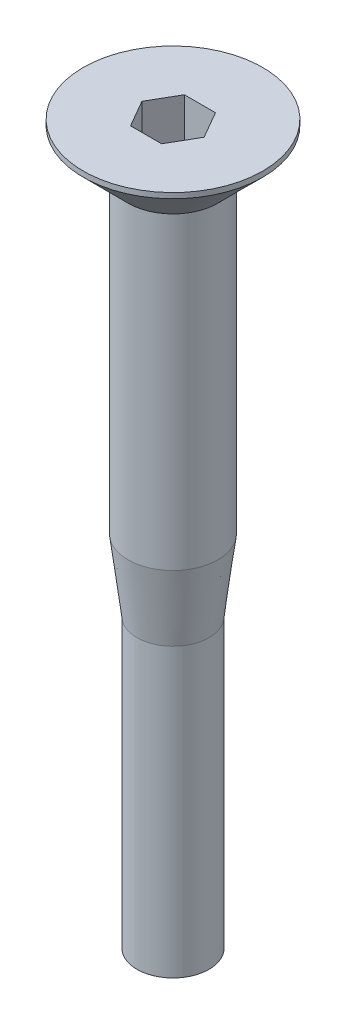
ISO-10303-21;
HEADER;
FILE_DESCRIPTION(('STEP AP214'),'2;1');
FILE_NAME('part.step','',(''),(''),'','','');
FILE_SCHEMA(('AUTOMOTIVE_DESIGN { 1 0 10303 214 1 1 1 1 }'));
ENDSEC;
DATA;
#1=APPLICATION_CONTEXT('core data for automotive mechanical design processes');
#2=APPLICATION_PROTOCOL_DEFINITION('international standard','automotive_design',2000,#1);
#3=PRODUCT_CONTEXT('',#1,'mechanical');
#4=PRODUCT('Part','Part','',(#3));
#5=PRODUCT_RELATED_PRODUCT_CATEGORY('part','',(#4));
#6=PRODUCT_DEFINITION_FORMATION('','',#4);
#7=PRODUCT_DEFINITION_CONTEXT('part definition',#1,'design');
#8=PRODUCT_DEFINITION('design','',#6,#7);
#9=PRODUCT_DEFINITION_SHAPE('','',#8);
#10=(LENGTH_UNIT() NAMED_UNIT(*) SI_UNIT(.MILLI.,.METRE.));
#11=(NAMED_UNIT(*) PLANE_ANGLE_UNIT() SI_UNIT($,.RADIAN.));
#12=(NAMED_UNIT(*) SI_UNIT($,.STERADIAN.) SOLID_ANGLE_UNIT());
#13=UNCERTAINTY_MEASURE_WITH_UNIT(LENGTH_MEASURE(1.E-05),#10,'distance_accuracy_value','');
#14=(GEOMETRIC_REPRESENTATION_CONTEXT(3) GLOBAL_UNCERTAINTY_ASSIGNED_CONTEXT((#13)) GLOBAL_UNIT_ASSIGNED_CONTEXT((#10,
#11,#12)) REPRESENTATION_CONTEXT('',''));
#15=CARTESIAN_POINT('',(0.,0.,0.));
#16=DIRECTION('',(0.,0.,1.));
#17=DIRECTION('',(1.,0.,0.));
#18=AXIS2_PLACEMENT_3D('',#15,#16,#17);
#19=CARTESIAN_POINT('',(0.,0.,0.));
#20=DIRECTION('',(0.,-1.,0.));
#21=DIRECTION('',(1.,0.,0.));
#22=AXIS2_PLACEMENT_3D('',#19,#20,#21);
#23=PLANE('',#22);
#24=DIRECTION('',(1.,0.,0.));
#25=VECTOR('',#24,1.);
#26=CARTESIAN_POINT('',(-0.866025403784437,0.,1.5));
#27=LINE('',#26,#25);
#28=CARTESIAN_POINT('',(-0.866025403784437,0.,1.5));
#29=VERTEX_POINT('',#28);
#30=CARTESIAN_POINT('',(0.866025403784437,0.,1.5));
#31=VERTEX_POINT('',#30);
#32=EDGE_CURVE('E121',#29,#31,#27,.T.);
#33=ORIENTED_EDGE('',*,*,#32,.F.);
#34=DIRECTION('',(0.499999999999998,0.,0.86602540378444));
#35=VECTOR('',#34,1.);
#36=CARTESIAN_POINT('',(-0.866025403784437,0.,1.5));
#37=LINE('',#36,#35);
#38=CARTESIAN_POINT('',(-1.73205080756887,0.,0.));
#39=VERTEX_POINT('',#38);
#40=EDGE_CURVE('E47',#39,#29,#37,.T.);
#41=ORIENTED_EDGE('',*,*,#40,.F.);
#42=DIRECTION('',(-0.499999999999998,0.,0.86602540378444));
#43=VECTOR('',#42,1.);
#44=CARTESIAN_POINT('',(-0.866025403784438,0.,-1.5));
#45=LINE('',#44,#43);
#46=CARTESIAN_POINT('',(-0.866025403784438,0.,-1.5));
#47=VERTEX_POINT('',#46);
#48=EDGE_CURVE('E130',#47,#39,#45,.T.);
#49=ORIENTED_EDGE('',*,*,#48,.F.);
#50=DIRECTION('',(-1.,0.,0.));
#51=VECTOR('',#50,1.);
#52=CARTESIAN_POINT('',(-0.866025403784438,0.,-1.5));
#53=LINE('',#52,#51);
#54=CARTESIAN_POINT('',(0.866025403784437,0.,-1.5));
#55=VERTEX_POINT('',#54);
#56=EDGE_CURVE('E128',#55,#47,#53,.T.);
#57=ORIENTED_EDGE('',*,*,#56,.F.);
#58=DIRECTION('',(-0.499999999999998,0.,-0.86602540378444));
#59=VECTOR('',#58,1.);
#60=CARTESIAN_POINT('',(0.866025403784437,0.,-1.5));
#61=LINE('',#60,#59);
#62=CARTESIAN_POINT('',(1.73205080756887,0.,0.));
#63=VERTEX_POINT('',#62);
#64=EDGE_CURVE('E95',#63,#55,#61,.T.);
#65=ORIENTED_EDGE('',*,*,#64,.F.);
#66=DIRECTION('',(0.499999999999998,0.,-0.86602540378444));
#67=VECTOR('',#66,1.);
#68=CARTESIAN_POINT('',(0.866025403784437,0.,1.5));
#69=LINE('',#68,#67);
#70=EDGE_CURVE('E124',#31,#63,#69,.T.);
#71=ORIENTED_EDGE('',*,*,#70,.F.);
#72=EDGE_LOOP('',(#33,#41,#49,#57,#65,#71));
#73=FACE_BOUND('',#72,.T.);
#74=CARTESIAN_POINT('',(0.,0.,0.));
#75=DIRECTION('',(0.,1.,0.));
#76=DIRECTION('',(-1.,0.,0.));
#77=AXIS2_PLACEMENT_3D('',#74,#75,#76);
#78=CIRCLE('',#77,5.);
#79=CARTESIAN_POINT('',(-5.,0.,0.));
#80=VERTEX_POINT('',#79);
#81=EDGE_CURVE('E11',#80,#80,#78,.T.);
#82=ORIENTED_EDGE('',*,*,#81,.T.);
#83=EDGE_LOOP('',(#82));
#84=FACE_BOUND('',#83,.T.);
#85=ADVANCED_FACE('F33',(#73,#84),#23,.F.);
#86=CARTESIAN_POINT('',(0.,0.,0.));
#87=DIRECTION('',(0.,1.,0.));
#88=DIRECTION('',(-1.,0.,0.));
#89=AXIS2_PLACEMENT_3D('',#86,#87,#88);
#90=CYLINDRICAL_SURFACE('',#89,5.);
#91=ORIENTED_EDGE('',*,*,#81,.F.);
#92=EDGE_LOOP('',(#91));
#93=FACE_BOUND('',#92,.T.);
#94=CARTESIAN_POINT('',(0.,-0.299999999999969,0.));
#95=DIRECTION('',(0.,1.,0.));
#96=DIRECTION('',(-1.,0.,0.));
#97=AXIS2_PLACEMENT_3D('',#94,#95,#96);
#98=CIRCLE('',#97,5.);
#99=CARTESIAN_POINT('',(-5.,-0.29999999999997,0.));
#100=VERTEX_POINT('',#99);
#101=EDGE_CURVE('E40',#100,#100,#98,.T.);
#102=ORIENTED_EDGE('',*,*,#101,.T.);
#103=EDGE_LOOP('',(#102));
#104=FACE_BOUND('',#103,.T.);
#105=ADVANCED_FACE('F153',(#93,#104),#90,.T.);
#106=CARTESIAN_POINT('',(0.,-2.8,0.));
#107=DIRECTION('',(0.,1.,0.));
#108=DIRECTION('',(-1.,0.,0.));
#109=AXIS2_PLACEMENT_3D('',#106,#107,#108);
#110=CONICAL_SURFACE('',#109,2.5,0.785398163397442);
#111=ORIENTED_EDGE('',*,*,#101,.F.);
#112=EDGE_LOOP('',(#111));
#113=FACE_BOUND('',#112,.T.);
#114=CARTESIAN_POINT('',(0.,-2.8,0.));
#115=DIRECTION('',(0.,1.,0.));
#116=DIRECTION('',(-1.,0.,0.));
#117=AXIS2_PLACEMENT_3D('',#114,#115,#116);
#118=CIRCLE('',#117,2.5);
#119=CARTESIAN_POINT('',(-2.5,-2.8,0.));
#120=VERTEX_POINT('',#119);
#121=EDGE_CURVE('E148',#120,#120,#118,.T.);
#122=ORIENTED_EDGE('',*,*,#121,.T.);
#123=EDGE_LOOP('',(#122));
#124=FACE_BOUND('',#123,.T.);
#125=ADVANCED_FACE('F155',(#113,#124),#110,.T.);
#126=CARTESIAN_POINT('',(0.,0.,0.));
#127=DIRECTION('',(0.,1.,0.));
#128=DIRECTION('',(-1.,0.,0.));
#129=AXIS2_PLACEMENT_3D('',#126,#127,#128);
#130=CYLINDRICAL_SURFACE('',#129,2.5);
#131=ORIENTED_EDGE('',*,*,#121,.F.);
#132=EDGE_LOOP('',(#131));
#133=FACE_BOUND('',#132,.T.);
#134=CARTESIAN_POINT('',(0.,-20.,0.));
#135=DIRECTION('',(0.,1.,0.));
#136=DIRECTION('',(-1.,0.,0.));
#137=AXIS2_PLACEMENT_3D('',#134,#135,#136);
#138=CIRCLE('',#137,2.5);
#139=CARTESIAN_POINT('',(-2.5,-20.,0.));
#140=VERTEX_POINT('',#139);
#141=EDGE_CURVE('E145',#140,#140,#138,.T.);
#142=ORIENTED_EDGE('',*,*,#141,.T.);
#143=EDGE_LOOP('',(#142));
#144=FACE_BOUND('',#143,.T.);
#145=ADVANCED_FACE('F158',(#133,#144),#130,.T.);
#146=CARTESIAN_POINT('',(0.,-24.,0.));
#147=DIRECTION('',(0.,1.,0.));
#148=DIRECTION('',(-1.,0.,0.));
#149=AXIS2_PLACEMENT_3D('',#146,#147,#148);
#150=CONICAL_SURFACE('',#149,2.0095,0.122015853524414);
#151=ORIENTED_EDGE('',*,*,#141,.F.);
#152=EDGE_LOOP('',(#151));
#153=FACE_BOUND('',#152,.T.);
#154=CARTESIAN_POINT('',(0.,-24.,0.));
#155=DIRECTION('',(0.,1.,0.));
#156=DIRECTION('',(-1.,0.,0.));
#157=AXIS2_PLACEMENT_3D('',#154,#155,#156);
#158=CIRCLE('',#157,2.0095);
#159=CARTESIAN_POINT('',(-2.0095,-24.,0.));
#160=VERTEX_POINT('',#159);
#161=EDGE_CURVE('E142',#160,#160,#158,.T.);
#162=ORIENTED_EDGE('',*,*,#161,.T.);
#163=EDGE_LOOP('',(#162));
#164=FACE_BOUND('',#163,.T.);
#165=ADVANCED_FACE('F164',(#153,#164),#150,.T.);
#166=CARTESIAN_POINT('',(0.,0.,0.));
#167=DIRECTION('',(0.,1.,0.));
#168=DIRECTION('',(-1.,0.,0.));
#169=AXIS2_PLACEMENT_3D('',#166,#167,#168);
#170=CYLINDRICAL_SURFACE('',#169,2.0095);
#171=ORIENTED_EDGE('',*,*,#161,.F.);
#172=EDGE_LOOP('',(#171));
#173=FACE_BOUND('',#172,.T.);
#174=CARTESIAN_POINT('',(0.,-40.,0.));
#175=DIRECTION('',(0.,1.,0.));
#176=DIRECTION('',(-1.,0.,0.));
#177=AXIS2_PLACEMENT_3D('',#174,#175,#176);
#178=CIRCLE('',#177,2.0095);
#179=CARTESIAN_POINT('',(-2.00949999999999,-40.,0.));
#180=VERTEX_POINT('',#179);
#181=EDGE_CURVE('E134',#180,#180,#178,.T.);
#182=ORIENTED_EDGE('',*,*,#181,.T.);
#183=EDGE_LOOP('',(#182));
#184=FACE_BOUND('',#183,.T.);
#185=ADVANCED_FACE('F170',(#173,#184),#170,.T.);
#186=CARTESIAN_POINT('',(2.0095,-40.,0.));
#187=DIRECTION('',(0.,1.,0.));
#188=DIRECTION('',(-1.,0.,0.));
#189=AXIS2_PLACEMENT_3D('',#186,#187,#188);
#190=PLANE('',#189);
#191=ORIENTED_EDGE('',*,*,#181,.F.);
#192=EDGE_LOOP('',(#191));
#193=FACE_BOUND('',#192,.T.);
#194=ADVANCED_FACE('F176',(#193),#190,.F.);
#195=CARTESIAN_POINT('',(-0.866025403784437,-5.3,1.5));
#196=DIRECTION('',(-0.86602540378444,0.,0.499999999999998));
#197=DIRECTION('',(0.499999999999998,0.,0.86602540378444));
#198=AXIS2_PLACEMENT_3D('',#195,#196,#197);
#199=PLANE('',#198);
#200=ORIENTED_EDGE('',*,*,#40,.T.);
#201=DIRECTION('',(0.,1.,0.));
#202=VECTOR('',#201,1.);
#203=CARTESIAN_POINT('',(-0.866025403784437,-5.3,1.5));
#204=LINE('',#203,#202);
#205=CARTESIAN_POINT('',(-0.866025403784437,-5.3,1.5));
#206=VERTEX_POINT('',#205);
#207=EDGE_CURVE('E77',#206,#29,#204,.T.);
#208=ORIENTED_EDGE('',*,*,#207,.F.);
#209=DIRECTION('',(0.499999999999998,0.,0.86602540378444));
#210=VECTOR('',#209,1.);
#211=CARTESIAN_POINT('',(-0.866025403784437,-5.3,1.5));
#212=LINE('',#211,#210);
#213=CARTESIAN_POINT('',(-1.73205080756887,-5.3,0.));
#214=VERTEX_POINT('',#213);
#215=EDGE_CURVE('E132',#214,#206,#212,.T.);
#216=ORIENTED_EDGE('',*,*,#215,.F.);
#217=DIRECTION('',(0.,1.,0.));
#218=VECTOR('',#217,1.);
#219=CARTESIAN_POINT('',(-1.73205080756887,-5.3,0.));
#220=LINE('',#219,#218);
#221=EDGE_CURVE('E55',#214,#39,#220,.T.);
#222=ORIENTED_EDGE('',*,*,#221,.T.);
#223=EDGE_LOOP('',(#200,#208,#216,#222));
#224=FACE_BOUND('',#223,.T.);
#225=ADVANCED_FACE('F181',(#224),#199,.F.);
#226=CARTESIAN_POINT('',(-0.866025403784438,-5.3,-1.5));
#227=DIRECTION('',(-0.86602540378444,0.,-0.499999999999998));
#228=DIRECTION('',(-0.499999999999998,0.,0.86602540378444));
#229=AXIS2_PLACEMENT_3D('',#226,#227,#228);
#230=PLANE('',#229);
#231=ORIENTED_EDGE('',*,*,#48,.T.);
#232=ORIENTED_EDGE('',*,*,#221,.F.);
#233=DIRECTION('',(-0.499999999999998,0.,0.86602540378444));
#234=VECTOR('',#233,1.);
#235=CARTESIAN_POINT('',(-0.866025403784438,-5.3,-1.5));
#236=LINE('',#235,#234);
#237=CARTESIAN_POINT('',(-0.866025403784438,-5.3,-1.5));
#238=VERTEX_POINT('',#237);
#239=EDGE_CURVE('E107',#238,#214,#236,.T.);
#240=ORIENTED_EDGE('',*,*,#239,.F.);
#241=DIRECTION('',(0.,1.,0.));
#242=VECTOR('',#241,1.);
#243=CARTESIAN_POINT('',(-0.866025403784438,-5.3,-1.5));
#244=LINE('',#243,#242);
#245=EDGE_CURVE('E99',#238,#47,#244,.T.);
#246=ORIENTED_EDGE('',*,*,#245,.T.);
#247=EDGE_LOOP('',(#231,#232,#240,#246));
#248=FACE_BOUND('',#247,.T.);
#249=ADVANCED_FACE('F186',(#248),#230,.F.);
#250=CARTESIAN_POINT('',(-0.866025403784438,-5.3,-1.5));
#251=DIRECTION('',(0.,0.,-1.));
#252=DIRECTION('',(-1.,0.,0.));
#253=AXIS2_PLACEMENT_3D('',#250,#251,#252);
#254=PLANE('',#253);
#255=ORIENTED_EDGE('',*,*,#56,.T.);
#256=ORIENTED_EDGE('',*,*,#245,.F.);
#257=DIRECTION('',(-1.,0.,0.));
#258=VECTOR('',#257,1.);
#259=CARTESIAN_POINT('',(-0.866025403784438,-5.3,-1.5));
#260=LINE('',#259,#258);
#261=CARTESIAN_POINT('',(0.866025403784437,-5.3,-1.5));
#262=VERTEX_POINT('',#261);
#263=EDGE_CURVE('E103',#262,#238,#260,.T.);
#264=ORIENTED_EDGE('',*,*,#263,.F.);
#265=DIRECTION('',(0.,1.,0.));
#266=VECTOR('',#265,1.);
#267=CARTESIAN_POINT('',(0.866025403784437,-5.3,-1.5));
#268=LINE('',#267,#266);
#269=EDGE_CURVE('E88',#262,#55,#268,.T.);
#270=ORIENTED_EDGE('',*,*,#269,.T.);
#271=EDGE_LOOP('',(#255,#256,#264,#270));
#272=FACE_BOUND('',#271,.T.);
#273=ADVANCED_FACE('F104',(#272),#254,.F.);
#274=CARTESIAN_POINT('',(0.866025403784437,-5.3,-1.5));
#275=DIRECTION('',(0.86602540378444,0.,-0.499999999999998));
#276=DIRECTION('',(-0.499999999999998,0.,-0.86602540378444));
#277=AXIS2_PLACEMENT_3D('',#274,#275,#276);
#278=PLANE('',#277);
#279=ORIENTED_EDGE('',*,*,#64,.T.);
#280=ORIENTED_EDGE('',*,*,#269,.F.);
#281=DIRECTION('',(-0.499999999999998,0.,-0.86602540378444));
#282=VECTOR('',#281,1.);
#283=CARTESIAN_POINT('',(0.866025403784437,-5.3,-1.5));
#284=LINE('',#283,#282);
#285=CARTESIAN_POINT('',(1.73205080756887,-5.3,0.));
#286=VERTEX_POINT('',#285);
#287=EDGE_CURVE('E92',#286,#262,#284,.T.);
#288=ORIENTED_EDGE('',*,*,#287,.F.);
#289=DIRECTION('',(0.,1.,0.));
#290=VECTOR('',#289,1.);
#291=CARTESIAN_POINT('',(1.73205080756887,-5.3,0.));
#292=LINE('',#291,#290);
#293=EDGE_CURVE('E100',#286,#63,#292,.T.);
#294=ORIENTED_EDGE('',*,*,#293,.T.);
#295=EDGE_LOOP('',(#279,#280,#288,#294));
#296=FACE_BOUND('',#295,.T.);
#297=ADVANCED_FACE('F90',(#296),#278,.F.);
#298=CARTESIAN_POINT('',(0.866025403784437,-5.3,1.5));
#299=DIRECTION('',(0.86602540378444,0.,0.499999999999998));
#300=DIRECTION('',(0.499999999999998,0.,-0.86602540378444));
#301=AXIS2_PLACEMENT_3D('',#298,#299,#300);
#302=PLANE('',#301);
#303=ORIENTED_EDGE('',*,*,#70,.T.);
#304=ORIENTED_EDGE('',*,*,#293,.F.);
#305=DIRECTION('',(0.499999999999998,0.,-0.86602540378444));
#306=VECTOR('',#305,1.);
#307=CARTESIAN_POINT('',(0.866025403784437,-5.3,1.5));
#308=LINE('',#307,#306);
#309=CARTESIAN_POINT('',(0.866025403784437,-5.3,1.5));
#310=VERTEX_POINT('',#309);
#311=EDGE_CURVE('E113',#310,#286,#308,.T.);
#312=ORIENTED_EDGE('',*,*,#311,.F.);
#313=DIRECTION('',(0.,1.,0.));
#314=VECTOR('',#313,1.);
#315=CARTESIAN_POINT('',(0.866025403784437,-5.3,1.5));
#316=LINE('',#315,#314);
#317=EDGE_CURVE('E137',#310,#31,#316,.T.);
#318=ORIENTED_EDGE('',*,*,#317,.T.);
#319=EDGE_LOOP('',(#303,#304,#312,#318));
#320=FACE_BOUND('',#319,.T.);
#321=ADVANCED_FACE('F212',(#320),#302,.F.);
#322=CARTESIAN_POINT('',(-0.866025403784437,-5.3,1.5));
#323=DIRECTION('',(0.,0.,1.));
#324=DIRECTION('',(1.,0.,0.));
#325=AXIS2_PLACEMENT_3D('',#322,#323,#324);
#326=PLANE('',#325);
#327=ORIENTED_EDGE('',*,*,#32,.T.);
#328=ORIENTED_EDGE('',*,*,#317,.F.);
#329=DIRECTION('',(1.,0.,0.));
#330=VECTOR('',#329,1.);
#331=CARTESIAN_POINT('',(-0.866025403784437,-5.3,1.5));
#332=LINE('',#331,#330);
#333=EDGE_CURVE('E115',#206,#310,#332,.T.);
#334=ORIENTED_EDGE('',*,*,#333,.F.);
#335=ORIENTED_EDGE('',*,*,#207,.T.);
#336=EDGE_LOOP('',(#327,#328,#334,#335));
#337=FACE_BOUND('',#336,.T.);
#338=ADVANCED_FACE('F200',(#337),#326,.F.);
#339=CARTESIAN_POINT('',(-0.866025403784437,-5.3,1.5));
#340=DIRECTION('',(0.,-1.,0.));
#341=DIRECTION('',(0.,0.,-1.));
#342=AXIS2_PLACEMENT_3D('',#339,#340,#341);
#343=PLANE('',#342);
#344=ORIENTED_EDGE('',*,*,#215,.T.);
#345=ORIENTED_EDGE('',*,*,#333,.T.);
#346=ORIENTED_EDGE('',*,*,#311,.T.);
#347=ORIENTED_EDGE('',*,*,#287,.T.);
#348=ORIENTED_EDGE('',*,*,#263,.T.);
#349=ORIENTED_EDGE('',*,*,#239,.T.);
#350=EDGE_LOOP('',(#344,#345,#346,#347,#348,#349));
#351=FACE_BOUND('',#350,.T.);
#352=ADVANCED_FACE('F110',(#351),#343,.F.);
#353=CLOSED_SHELL('',(#85,#105,#125,#145,#165,#185,#194,#225,#249,#273,#297,#321,#338,#352));
#354=MANIFOLD_SOLID_BREP('B2',#353);
#355=ADVANCED_BREP_SHAPE_REPRESENTATION('',(#18,#354),#14);
#356=SHAPE_DEFINITION_REPRESENTATION(#9,#355);
ENDSEC;
END-ISO-10303-21;
